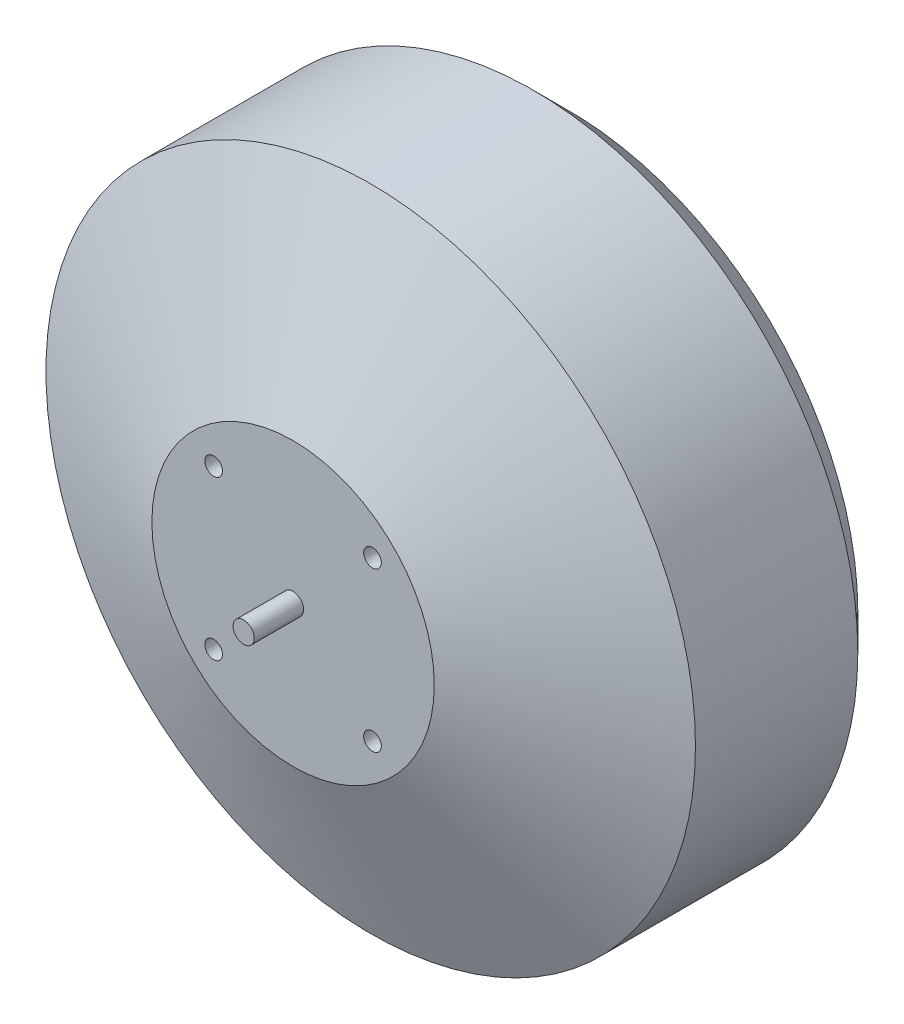
ISO-10303-21;
HEADER;
FILE_DESCRIPTION(('STEP AP214'),'2;1');
FILE_NAME('part.step','',(''),(''),'','','');
FILE_SCHEMA(('AUTOMOTIVE_DESIGN { 1 0 10303 214 1 1 1 1 }'));
ENDSEC;
DATA;
#1=APPLICATION_CONTEXT('core data for automotive mechanical design processes');
#2=APPLICATION_PROTOCOL_DEFINITION('international standard','automotive_design',2000,#1);
#3=PRODUCT_CONTEXT('',#1,'mechanical');
#4=PRODUCT('Part','Part','',(#3));
#5=PRODUCT_RELATED_PRODUCT_CATEGORY('part','',(#4));
#6=PRODUCT_DEFINITION_FORMATION('','',#4);
#7=PRODUCT_DEFINITION_CONTEXT('part definition',#1,'design');
#8=PRODUCT_DEFINITION('design','',#6,#7);
#9=PRODUCT_DEFINITION_SHAPE('','',#8);
#10=(LENGTH_UNIT() NAMED_UNIT(*) SI_UNIT(.MILLI.,.METRE.));
#11=(NAMED_UNIT(*) PLANE_ANGLE_UNIT() SI_UNIT($,.RADIAN.));
#12=(NAMED_UNIT(*) SI_UNIT($,.STERADIAN.) SOLID_ANGLE_UNIT());
#13=UNCERTAINTY_MEASURE_WITH_UNIT(LENGTH_MEASURE(1.E-05),#10,'distance_accuracy_value','');
#14=(GEOMETRIC_REPRESENTATION_CONTEXT(3) GLOBAL_UNCERTAINTY_ASSIGNED_CONTEXT((#13)) GLOBAL_UNIT_ASSIGNED_CONTEXT((#10,
#11,#12)) REPRESENTATION_CONTEXT('',''));
#15=CARTESIAN_POINT('',(0.,0.,0.));
#16=DIRECTION('',(0.,0.,1.));
#17=DIRECTION('',(1.,0.,0.));
#18=AXIS2_PLACEMENT_3D('',#15,#16,#17);
#19=CARTESIAN_POINT('',(0.,46.,0.));
#20=DIRECTION('',(0.,0.,1.));
#21=DIRECTION('',(1.,0.,0.));
#22=AXIS2_PLACEMENT_3D('',#19,#20,#21);
#23=PLANE('',#22);
#24=CARTESIAN_POINT('',(0.,0.,0.));
#25=DIRECTION('',(0.,0.,1.));
#26=DIRECTION('',(1.,0.,0.));
#27=AXIS2_PLACEMENT_3D('',#24,#25,#26);
#28=CIRCLE('',#27,40.9999999999999);
#29=CARTESIAN_POINT('',(40.9999999999999,0.,0.));
#30=VERTEX_POINT('',#29);
#31=EDGE_CURVE('E10',#30,#30,#28,.F.);
#32=ORIENTED_EDGE('',*,*,#31,.T.);
#33=EDGE_LOOP('',(#32));
#34=FACE_BOUND('',#33,.T.);
#35=CARTESIAN_POINT('',(0.,0.,0.));
#36=DIRECTION('',(0.,0.,1.));
#37=DIRECTION('',(1.,0.,0.));
#38=AXIS2_PLACEMENT_3D('',#35,#36,#37);
#39=CIRCLE('',#38,2.75);
#40=CARTESIAN_POINT('',(2.75,0.,0.));
#41=VERTEX_POINT('',#40);
#42=EDGE_CURVE('E46',#41,#41,#39,.T.);
#43=ORIENTED_EDGE('',*,*,#42,.T.);
#44=EDGE_LOOP('',(#43));
#45=FACE_BOUND('',#44,.T.);
#46=CARTESIAN_POINT('',(14.25,-14.25,0.));
#47=DIRECTION('',(0.,0.,-1.));
#48=DIRECTION('',(-1.,0.,0.));
#49=AXIS2_PLACEMENT_3D('',#46,#47,#48);
#50=CIRCLE('',#49,1.75);
#51=CARTESIAN_POINT('',(12.5,-14.25,0.));
#52=VERTEX_POINT('',#51);
#53=EDGE_CURVE('E91',#52,#52,#50,.T.);
#54=ORIENTED_EDGE('',*,*,#53,.F.);
#55=EDGE_LOOP('',(#54));
#56=FACE_BOUND('',#55,.T.);
#57=CARTESIAN_POINT('',(-14.25,-14.25,0.));
#58=DIRECTION('',(0.,0.,-1.));
#59=DIRECTION('',(-1.,0.,0.));
#60=AXIS2_PLACEMENT_3D('',#57,#58,#59);
#61=CIRCLE('',#60,1.75);
#62=CARTESIAN_POINT('',(-16.,-14.25,0.));
#63=VERTEX_POINT('',#62);
#64=EDGE_CURVE('E98',#63,#63,#61,.T.);
#65=ORIENTED_EDGE('',*,*,#64,.F.);
#66=EDGE_LOOP('',(#65));
#67=FACE_BOUND('',#66,.T.);
#68=CARTESIAN_POINT('',(-14.25,14.25,0.));
#69=DIRECTION('',(0.,0.,-1.));
#70=DIRECTION('',(-1.,0.,0.));
#71=AXIS2_PLACEMENT_3D('',#68,#69,#70);
#72=CIRCLE('',#71,1.75);
#73=CARTESIAN_POINT('',(-16.,14.25,0.));
#74=VERTEX_POINT('',#73);
#75=EDGE_CURVE('E104',#74,#74,#72,.T.);
#76=ORIENTED_EDGE('',*,*,#75,.F.);
#77=EDGE_LOOP('',(#76));
#78=FACE_BOUND('',#77,.T.);
#79=CARTESIAN_POINT('',(14.25,14.25,0.));
#80=DIRECTION('',(0.,0.,-1.));
#81=DIRECTION('',(-1.,0.,0.));
#82=AXIS2_PLACEMENT_3D('',#79,#80,#81);
#83=CIRCLE('',#82,1.75);
#84=CARTESIAN_POINT('',(12.5,14.25,0.));
#85=VERTEX_POINT('',#84);
#86=EDGE_CURVE('E85',#85,#85,#83,.T.);
#87=ORIENTED_EDGE('',*,*,#86,.F.);
#88=EDGE_LOOP('',(#87));
#89=FACE_BOUND('',#88,.T.);
#90=ADVANCED_FACE('F31',(#34,#45,#56,#67,#78,#89),#23,.F.);
#91=CARTESIAN_POINT('',(0.,0.,1764.48103895637));
#92=DIRECTION('',(0.,0.,1.));
#93=DIRECTION('',(1.,0.,0.));
#94=AXIS2_PLACEMENT_3D('',#91,#92,#93);
#95=CYLINDRICAL_SURFACE('',#94,46.);
#96=CARTESIAN_POINT('',(0.,0.,5.00000000000012));
#97=DIRECTION('',(0.,0.,1.));
#98=DIRECTION('',(1.,0.,0.));
#99=AXIS2_PLACEMENT_3D('',#96,#97,#98);
#100=CIRCLE('',#99,46.);
#101=CARTESIAN_POINT('',(46.,0.,5.00000000000012));
#102=VERTEX_POINT('',#101);
#103=EDGE_CURVE('E38',#102,#102,#100,.T.);
#104=ORIENTED_EDGE('',*,*,#103,.T.);
#105=EDGE_LOOP('',(#104));
#106=FACE_BOUND('',#105,.T.);
#107=CARTESIAN_POINT('',(0.,0.,28.));
#108=DIRECTION('',(0.,0.,1.));
#109=DIRECTION('',(1.,0.,0.));
#110=AXIS2_PLACEMENT_3D('',#107,#108,#109);
#111=CIRCLE('',#110,46.);
#112=CARTESIAN_POINT('',(46.,0.,28.));
#113=VERTEX_POINT('',#112);
#114=EDGE_CURVE('E54',#113,#113,#111,.T.);
#115=ORIENTED_EDGE('',*,*,#114,.F.);
#116=EDGE_LOOP('',(#115));
#117=FACE_BOUND('',#116,.T.);
#118=ADVANCED_FACE('F142',(#106,#117),#95,.T.);
#119=CARTESIAN_POINT('',(0.,0.,28.));
#120=DIRECTION('',(0.,0.,-1.));
#121=DIRECTION('',(-1.,0.,0.));
#122=AXIS2_PLACEMENT_3D('',#119,#120,#121);
#123=CONICAL_SURFACE('',#122,46.,1.17055566976093);
#124=CARTESIAN_POINT('',(0.,0.,38.9999999999999));
#125=DIRECTION('',(0.,0.,1.));
#126=DIRECTION('',(1.,0.,0.));
#127=AXIS2_PLACEMENT_3D('',#124,#125,#126);
#128=CIRCLE('',#127,20.);
#129=CARTESIAN_POINT('',(20.,0.,38.9999999999999));
#130=VERTEX_POINT('',#129);
#131=EDGE_CURVE('E57',#130,#130,#128,.T.);
#132=ORIENTED_EDGE('',*,*,#131,.F.);
#133=EDGE_LOOP('',(#132));
#134=FACE_BOUND('',#133,.T.);
#135=ORIENTED_EDGE('',*,*,#114,.T.);
#136=EDGE_LOOP('',(#135));
#137=FACE_BOUND('',#136,.T.);
#138=ADVANCED_FACE('F128',(#134,#137),#123,.T.);
#139=CARTESIAN_POINT('',(0.,20.,39.));
#140=DIRECTION('',(0.,0.,-1.));
#141=DIRECTION('',(-1.,0.,0.));
#142=AXIS2_PLACEMENT_3D('',#139,#140,#141);
#143=PLANE('',#142);
#144=CARTESIAN_POINT('',(0.,0.,39.));
#145=DIRECTION('',(0.,0.,-1.));
#146=DIRECTION('',(-1.,0.,0.));
#147=AXIS2_PLACEMENT_3D('',#144,#145,#146);
#148=CIRCLE('',#147,1.5);
#149=CARTESIAN_POINT('',(-1.5,0.,39.));
#150=VERTEX_POINT('',#149);
#151=EDGE_CURVE('E42',#150,#150,#148,.F.);
#152=ORIENTED_EDGE('',*,*,#151,.F.);
#153=EDGE_LOOP('',(#152));
#154=FACE_BOUND('',#153,.T.);
#155=CARTESIAN_POINT('',(-11.25,-11.25,39.));
#156=DIRECTION('',(0.,0.,1.));
#157=DIRECTION('',(1.,0.,0.));
#158=AXIS2_PLACEMENT_3D('',#155,#156,#157);
#159=CIRCLE('',#158,1.25);
#160=CARTESIAN_POINT('',(-10.,-11.25,39.));
#161=VERTEX_POINT('',#160);
#162=EDGE_CURVE('E67',#161,#161,#159,.T.);
#163=ORIENTED_EDGE('',*,*,#162,.F.);
#164=EDGE_LOOP('',(#163));
#165=FACE_BOUND('',#164,.T.);
#166=CARTESIAN_POINT('',(11.25,-11.25,39.));
#167=DIRECTION('',(0.,0.,1.));
#168=DIRECTION('',(1.,0.,0.));
#169=AXIS2_PLACEMENT_3D('',#166,#167,#168);
#170=CIRCLE('',#169,1.25);
#171=CARTESIAN_POINT('',(12.5,-11.25,39.));
#172=VERTEX_POINT('',#171);
#173=EDGE_CURVE('E74',#172,#172,#170,.T.);
#174=ORIENTED_EDGE('',*,*,#173,.F.);
#175=EDGE_LOOP('',(#174));
#176=FACE_BOUND('',#175,.T.);
#177=CARTESIAN_POINT('',(11.25,11.25,39.));
#178=DIRECTION('',(0.,0.,1.));
#179=DIRECTION('',(1.,0.,0.));
#180=AXIS2_PLACEMENT_3D('',#177,#178,#179);
#181=CIRCLE('',#180,1.25);
#182=CARTESIAN_POINT('',(12.5,11.25,39.));
#183=VERTEX_POINT('',#182);
#184=EDGE_CURVE('E80',#183,#183,#181,.T.);
#185=ORIENTED_EDGE('',*,*,#184,.F.);
#186=EDGE_LOOP('',(#185));
#187=FACE_BOUND('',#186,.T.);
#188=CARTESIAN_POINT('',(-11.25,11.25,39.));
#189=DIRECTION('',(0.,0.,1.));
#190=DIRECTION('',(1.,0.,0.));
#191=AXIS2_PLACEMENT_3D('',#188,#189,#190);
#192=CIRCLE('',#191,1.25);
#193=CARTESIAN_POINT('',(-10.,11.25,39.));
#194=VERTEX_POINT('',#193);
#195=EDGE_CURVE('E61',#194,#194,#192,.T.);
#196=ORIENTED_EDGE('',*,*,#195,.F.);
#197=EDGE_LOOP('',(#196));
#198=FACE_BOUND('',#197,.T.);
#199=ORIENTED_EDGE('',*,*,#131,.T.);
#200=EDGE_LOOP('',(#199));
#201=FACE_BOUND('',#200,.T.);
#202=ADVANCED_FACE('F124',(#154,#165,#176,#187,#198,#201),#143,.F.);
#203=CARTESIAN_POINT('',(-11.25,11.25,29.));
#204=DIRECTION('',(0.,0.,1.));
#205=DIRECTION('',(1.,0.,0.));
#206=AXIS2_PLACEMENT_3D('',#203,#204,#205);
#207=CYLINDRICAL_SURFACE('',#206,1.25);
#208=CARTESIAN_POINT('',(-11.25,11.25,29.));
#209=DIRECTION('',(0.,0.,1.));
#210=DIRECTION('',(1.,0.,0.));
#211=AXIS2_PLACEMENT_3D('',#208,#209,#210);
#212=CIRCLE('',#211,1.25);
#213=CARTESIAN_POINT('',(-10.,11.25,29.));
#214=VERTEX_POINT('',#213);
#215=EDGE_CURVE('E60',#214,#214,#212,.T.);
#216=ORIENTED_EDGE('',*,*,#215,.F.);
#217=EDGE_LOOP('',(#216));
#218=FACE_BOUND('',#217,.T.);
#219=ORIENTED_EDGE('',*,*,#195,.T.);
#220=EDGE_LOOP('',(#219));
#221=FACE_BOUND('',#220,.T.);
#222=ADVANCED_FACE('F127',(#218,#221),#207,.F.);
#223=CARTESIAN_POINT('',(-11.25,11.25,29.));
#224=DIRECTION('',(0.,0.,1.));
#225=DIRECTION('',(1.,0.,0.));
#226=AXIS2_PLACEMENT_3D('',#223,#224,#225);
#227=PLANE('',#226);
#228=ORIENTED_EDGE('',*,*,#215,.T.);
#229=EDGE_LOOP('',(#228));
#230=FACE_BOUND('',#229,.T.);
#231=ADVANCED_FACE('F214',(#230),#227,.T.);
#232=CARTESIAN_POINT('',(11.25,11.25,29.));
#233=DIRECTION('',(0.,0.,1.));
#234=DIRECTION('',(1.,0.,0.));
#235=AXIS2_PLACEMENT_3D('',#232,#233,#234);
#236=CYLINDRICAL_SURFACE('',#235,1.25);
#237=CARTESIAN_POINT('',(11.25,11.25,29.));
#238=DIRECTION('',(0.,0.,1.));
#239=DIRECTION('',(1.,0.,0.));
#240=AXIS2_PLACEMENT_3D('',#237,#238,#239);
#241=CIRCLE('',#240,1.25);
#242=CARTESIAN_POINT('',(12.5,11.25,29.));
#243=VERTEX_POINT('',#242);
#244=EDGE_CURVE('E64',#243,#243,#241,.T.);
#245=ORIENTED_EDGE('',*,*,#244,.F.);
#246=EDGE_LOOP('',(#245));
#247=FACE_BOUND('',#246,.T.);
#248=ORIENTED_EDGE('',*,*,#184,.T.);
#249=EDGE_LOOP('',(#248));
#250=FACE_BOUND('',#249,.T.);
#251=ADVANCED_FACE('F210',(#247,#250),#236,.F.);
#252=CARTESIAN_POINT('',(11.25,11.25,29.));
#253=DIRECTION('',(0.,0.,1.));
#254=DIRECTION('',(1.,0.,0.));
#255=AXIS2_PLACEMENT_3D('',#252,#253,#254);
#256=PLANE('',#255);
#257=ORIENTED_EDGE('',*,*,#244,.T.);
#258=EDGE_LOOP('',(#257));
#259=FACE_BOUND('',#258,.T.);
#260=ADVANCED_FACE('F206',(#259),#256,.T.);
#261=CARTESIAN_POINT('',(11.25,-11.25,29.));
#262=DIRECTION('',(0.,0.,1.));
#263=DIRECTION('',(1.,0.,0.));
#264=AXIS2_PLACEMENT_3D('',#261,#262,#263);
#265=CYLINDRICAL_SURFACE('',#264,1.25);
#266=CARTESIAN_POINT('',(11.25,-11.25,29.));
#267=DIRECTION('',(0.,0.,1.));
#268=DIRECTION('',(1.,0.,0.));
#269=AXIS2_PLACEMENT_3D('',#266,#267,#268);
#270=CIRCLE('',#269,1.25);
#271=CARTESIAN_POINT('',(12.5,-11.25,29.));
#272=VERTEX_POINT('',#271);
#273=EDGE_CURVE('E77',#272,#272,#270,.T.);
#274=ORIENTED_EDGE('',*,*,#273,.F.);
#275=EDGE_LOOP('',(#274));
#276=FACE_BOUND('',#275,.T.);
#277=ORIENTED_EDGE('',*,*,#173,.T.);
#278=EDGE_LOOP('',(#277));
#279=FACE_BOUND('',#278,.T.);
#280=ADVANCED_FACE('F209',(#276,#279),#265,.F.);
#281=CARTESIAN_POINT('',(11.25,-11.25,29.));
#282=DIRECTION('',(0.,0.,1.));
#283=DIRECTION('',(1.,0.,0.));
#284=AXIS2_PLACEMENT_3D('',#281,#282,#283);
#285=PLANE('',#284);
#286=ORIENTED_EDGE('',*,*,#273,.T.);
#287=EDGE_LOOP('',(#286));
#288=FACE_BOUND('',#287,.T.);
#289=ADVANCED_FACE('F216',(#288),#285,.T.);
#290=CARTESIAN_POINT('',(-11.25,-11.25,29.));
#291=DIRECTION('',(0.,0.,1.));
#292=DIRECTION('',(1.,0.,0.));
#293=AXIS2_PLACEMENT_3D('',#290,#291,#292);
#294=CYLINDRICAL_SURFACE('',#293,1.25);
#295=CARTESIAN_POINT('',(-11.25,-11.25,29.));
#296=DIRECTION('',(0.,0.,1.));
#297=DIRECTION('',(1.,0.,0.));
#298=AXIS2_PLACEMENT_3D('',#295,#296,#297);
#299=CIRCLE('',#298,1.25);
#300=CARTESIAN_POINT('',(-10.,-11.25,29.));
#301=VERTEX_POINT('',#300);
#302=EDGE_CURVE('E70',#301,#301,#299,.T.);
#303=ORIENTED_EDGE('',*,*,#302,.F.);
#304=EDGE_LOOP('',(#303));
#305=FACE_BOUND('',#304,.T.);
#306=ORIENTED_EDGE('',*,*,#162,.T.);
#307=EDGE_LOOP('',(#306));
#308=FACE_BOUND('',#307,.T.);
#309=ADVANCED_FACE('F219',(#305,#308),#294,.F.);
#310=CARTESIAN_POINT('',(-11.25,-11.25,29.));
#311=DIRECTION('',(0.,0.,1.));
#312=DIRECTION('',(1.,0.,0.));
#313=AXIS2_PLACEMENT_3D('',#310,#311,#312);
#314=PLANE('',#313);
#315=ORIENTED_EDGE('',*,*,#302,.T.);
#316=EDGE_LOOP('',(#315));
#317=FACE_BOUND('',#316,.T.);
#318=ADVANCED_FACE('F204',(#317),#314,.T.);
#319=CARTESIAN_POINT('',(14.25,14.25,10.));
#320=DIRECTION('',(0.,0.,-1.));
#321=DIRECTION('',(-1.,0.,0.));
#322=AXIS2_PLACEMENT_3D('',#319,#320,#321);
#323=CYLINDRICAL_SURFACE('',#322,1.75);
#324=CARTESIAN_POINT('',(14.25,14.25,10.));
#325=DIRECTION('',(0.,0.,-1.));
#326=DIRECTION('',(-1.,0.,0.));
#327=AXIS2_PLACEMENT_3D('',#324,#325,#326);
#328=CIRCLE('',#327,1.75);
#329=CARTESIAN_POINT('',(12.5,14.25,10.));
#330=VERTEX_POINT('',#329);
#331=EDGE_CURVE('E71',#330,#330,#328,.T.);
#332=ORIENTED_EDGE('',*,*,#331,.F.);
#333=EDGE_LOOP('',(#332));
#334=FACE_BOUND('',#333,.T.);
#335=ORIENTED_EDGE('',*,*,#86,.T.);
#336=EDGE_LOOP('',(#335));
#337=FACE_BOUND('',#336,.T.);
#338=ADVANCED_FACE('F200',(#334,#337),#323,.F.);
#339=CARTESIAN_POINT('',(14.25,14.25,10.));
#340=DIRECTION('',(0.,0.,-1.));
#341=DIRECTION('',(-1.,0.,0.));
#342=AXIS2_PLACEMENT_3D('',#339,#340,#341);
#343=PLANE('',#342);
#344=ORIENTED_EDGE('',*,*,#331,.T.);
#345=EDGE_LOOP('',(#344));
#346=FACE_BOUND('',#345,.T.);
#347=ADVANCED_FACE('F186',(#346),#343,.T.);
#348=CARTESIAN_POINT('',(-14.25,14.25,10.));
#349=DIRECTION('',(0.,0.,-1.));
#350=DIRECTION('',(-1.,0.,0.));
#351=AXIS2_PLACEMENT_3D('',#348,#349,#350);
#352=CYLINDRICAL_SURFACE('',#351,1.75);
#353=CARTESIAN_POINT('',(-14.25,14.25,10.));
#354=DIRECTION('',(0.,0.,-1.));
#355=DIRECTION('',(-1.,0.,0.));
#356=AXIS2_PLACEMENT_3D('',#353,#354,#355);
#357=CIRCLE('',#356,1.75);
#358=CARTESIAN_POINT('',(-16.,14.25,10.));
#359=VERTEX_POINT('',#358);
#360=EDGE_CURVE('E88',#359,#359,#357,.T.);
#361=ORIENTED_EDGE('',*,*,#360,.F.);
#362=EDGE_LOOP('',(#361));
#363=FACE_BOUND('',#362,.T.);
#364=ORIENTED_EDGE('',*,*,#75,.T.);
#365=EDGE_LOOP('',(#364));
#366=FACE_BOUND('',#365,.T.);
#367=ADVANCED_FACE('F182',(#363,#366),#352,.F.);
#368=CARTESIAN_POINT('',(-14.25,14.25,10.));
#369=DIRECTION('',(0.,0.,-1.));
#370=DIRECTION('',(-1.,0.,0.));
#371=AXIS2_PLACEMENT_3D('',#368,#369,#370);
#372=PLANE('',#371);
#373=ORIENTED_EDGE('',*,*,#360,.T.);
#374=EDGE_LOOP('',(#373));
#375=FACE_BOUND('',#374,.T.);
#376=ADVANCED_FACE('F178',(#375),#372,.T.);
#377=CARTESIAN_POINT('',(-14.25,-14.25,10.));
#378=DIRECTION('',(0.,0.,-1.));
#379=DIRECTION('',(-1.,0.,0.));
#380=AXIS2_PLACEMENT_3D('',#377,#378,#379);
#381=CYLINDRICAL_SURFACE('',#380,1.75);
#382=CARTESIAN_POINT('',(-14.25,-14.25,10.));
#383=DIRECTION('',(0.,0.,-1.));
#384=DIRECTION('',(-1.,0.,0.));
#385=AXIS2_PLACEMENT_3D('',#382,#383,#384);
#386=CIRCLE('',#385,1.75);
#387=CARTESIAN_POINT('',(-16.,-14.25,10.));
#388=VERTEX_POINT('',#387);
#389=EDGE_CURVE('E101',#388,#388,#386,.T.);
#390=ORIENTED_EDGE('',*,*,#389,.F.);
#391=EDGE_LOOP('',(#390));
#392=FACE_BOUND('',#391,.T.);
#393=ORIENTED_EDGE('',*,*,#64,.T.);
#394=EDGE_LOOP('',(#393));
#395=FACE_BOUND('',#394,.T.);
#396=ADVANCED_FACE('F181',(#392,#395),#381,.F.);
#397=CARTESIAN_POINT('',(-14.25,-14.25,10.));
#398=DIRECTION('',(0.,0.,-1.));
#399=DIRECTION('',(-1.,0.,0.));
#400=AXIS2_PLACEMENT_3D('',#397,#398,#399);
#401=PLANE('',#400);
#402=ORIENTED_EDGE('',*,*,#389,.T.);
#403=EDGE_LOOP('',(#402));
#404=FACE_BOUND('',#403,.T.);
#405=ADVANCED_FACE('F188',(#404),#401,.T.);
#406=CARTESIAN_POINT('',(14.25,-14.25,10.));
#407=DIRECTION('',(0.,0.,-1.));
#408=DIRECTION('',(-1.,0.,0.));
#409=AXIS2_PLACEMENT_3D('',#406,#407,#408);
#410=CYLINDRICAL_SURFACE('',#409,1.75);
#411=CARTESIAN_POINT('',(14.25,-14.25,10.));
#412=DIRECTION('',(0.,0.,-1.));
#413=DIRECTION('',(-1.,0.,0.));
#414=AXIS2_PLACEMENT_3D('',#411,#412,#413);
#415=CIRCLE('',#414,1.75);
#416=CARTESIAN_POINT('',(12.5,-14.25,10.));
#417=VERTEX_POINT('',#416);
#418=EDGE_CURVE('E94',#417,#417,#415,.T.);
#419=ORIENTED_EDGE('',*,*,#418,.F.);
#420=EDGE_LOOP('',(#419));
#421=FACE_BOUND('',#420,.T.);
#422=ORIENTED_EDGE('',*,*,#53,.T.);
#423=EDGE_LOOP('',(#422));
#424=FACE_BOUND('',#423,.T.);
#425=ADVANCED_FACE('F174',(#421,#424),#410,.F.);
#426=CARTESIAN_POINT('',(14.25,-14.25,10.));
#427=DIRECTION('',(0.,0.,-1.));
#428=DIRECTION('',(-1.,0.,0.));
#429=AXIS2_PLACEMENT_3D('',#426,#427,#428);
#430=PLANE('',#429);
#431=ORIENTED_EDGE('',*,*,#418,.T.);
#432=EDGE_LOOP('',(#431));
#433=FACE_BOUND('',#432,.T.);
#434=ADVANCED_FACE('F168',(#433),#430,.T.);
#435=CARTESIAN_POINT('',(0.,0.,5.));
#436=DIRECTION('',(0.,0.,-1.));
#437=DIRECTION('',(-1.,0.,0.));
#438=AXIS2_PLACEMENT_3D('',#435,#436,#437);
#439=CYLINDRICAL_SURFACE('',#438,1.75);
#440=CARTESIAN_POINT('',(0.,0.,1.));
#441=DIRECTION('',(0.,0.,1.));
#442=DIRECTION('',(1.,0.,0.));
#443=AXIS2_PLACEMENT_3D('',#440,#441,#442);
#444=CIRCLE('',#443,1.75);
#445=CARTESIAN_POINT('',(1.75,0.,1.));
#446=VERTEX_POINT('',#445);
#447=EDGE_CURVE('E51',#446,#446,#444,.F.);
#448=ORIENTED_EDGE('',*,*,#447,.T.);
#449=EDGE_LOOP('',(#448));
#450=FACE_BOUND('',#449,.T.);
#451=CARTESIAN_POINT('',(0.,0.,5.));
#452=DIRECTION('',(0.,0.,-1.));
#453=DIRECTION('',(-1.,0.,0.));
#454=AXIS2_PLACEMENT_3D('',#451,#452,#453);
#455=CIRCLE('',#454,1.75);
#456=CARTESIAN_POINT('',(-1.75,0.,5.));
#457=VERTEX_POINT('',#456);
#458=EDGE_CURVE('E95',#457,#457,#455,.T.);
#459=ORIENTED_EDGE('',*,*,#458,.F.);
#460=EDGE_LOOP('',(#459));
#461=FACE_BOUND('',#460,.T.);
#462=ADVANCED_FACE('F159',(#450,#461),#439,.F.);
#463=CARTESIAN_POINT('',(0.,0.,5.));
#464=DIRECTION('',(0.,0.,-1.));
#465=DIRECTION('',(-1.,0.,0.));
#466=AXIS2_PLACEMENT_3D('',#463,#464,#465);
#467=PLANE('',#466);
#468=ORIENTED_EDGE('',*,*,#458,.T.);
#469=EDGE_LOOP('',(#468));
#470=FACE_BOUND('',#469,.T.);
#471=ADVANCED_FACE('F154',(#470),#467,.T.);
#472=CARTESIAN_POINT('',(0.,0.,1.));
#473=DIRECTION('',(0.,0.,1.));
#474=DIRECTION('',(1.,0.,0.));
#475=AXIS2_PLACEMENT_3D('',#472,#473,#474);
#476=TOROIDAL_SURFACE('',#475,2.75,1.);
#477=ORIENTED_EDGE('',*,*,#42,.F.);
#478=EDGE_LOOP('',(#477));
#479=FACE_BOUND('',#478,.T.);
#480=ORIENTED_EDGE('',*,*,#447,.F.);
#481=EDGE_LOOP('',(#480));
#482=FACE_BOUND('',#481,.T.);
#483=ADVANCED_FACE('F120',(#479,#482),#476,.T.);
#484=CARTESIAN_POINT('',(0.,0.,46.));
#485=DIRECTION('',(0.,0.,-1.));
#486=DIRECTION('',(-1.,0.,0.));
#487=AXIS2_PLACEMENT_3D('',#484,#485,#486);
#488=CYLINDRICAL_SURFACE('',#487,1.5);
#489=CARTESIAN_POINT('',(0.,0.,46.));
#490=DIRECTION('',(0.,0.,1.));
#491=DIRECTION('',(1.,0.,0.));
#492=AXIS2_PLACEMENT_3D('',#489,#490,#491);
#493=CIRCLE('',#492,1.5);
#494=CARTESIAN_POINT('',(1.5,0.,46.));
#495=VERTEX_POINT('',#494);
#496=EDGE_CURVE('E111',#495,#495,#493,.T.);
#497=ORIENTED_EDGE('',*,*,#496,.F.);
#498=EDGE_LOOP('',(#497));
#499=FACE_BOUND('',#498,.T.);
#500=ORIENTED_EDGE('',*,*,#151,.T.);
#501=EDGE_LOOP('',(#500));
#502=FACE_BOUND('',#501,.T.);
#503=ADVANCED_FACE('F117',(#499,#502),#488,.T.);
#504=CARTESIAN_POINT('',(0.,0.,46.));
#505=DIRECTION('',(0.,0.,1.));
#506=DIRECTION('',(1.,0.,0.));
#507=AXIS2_PLACEMENT_3D('',#504,#505,#506);
#508=PLANE('',#507);
#509=ORIENTED_EDGE('',*,*,#496,.T.);
#510=EDGE_LOOP('',(#509));
#511=FACE_BOUND('',#510,.T.);
#512=ADVANCED_FACE('F115',(#511),#508,.T.);
#513=CARTESIAN_POINT('',(0.,0.,5.00000000000012));
#514=DIRECTION('',(0.,0.,1.));
#515=DIRECTION('',(1.,0.,0.));
#516=AXIS2_PLACEMENT_3D('',#513,#514,#515);
#517=CONICAL_SURFACE('',#516,46.,0.785398163397448);
#518=ORIENTED_EDGE('',*,*,#31,.F.);
#519=EDGE_LOOP('',(#518));
#520=FACE_BOUND('',#519,.T.);
#521=ORIENTED_EDGE('',*,*,#103,.F.);
#522=EDGE_LOOP('',(#521));
#523=FACE_BOUND('',#522,.T.);
#524=ADVANCED_FACE('F33',(#520,#523),#517,.T.);
#525=CLOSED_SHELL('',(#90,#118,#138,#202,#222,#231,#251,#260,#280,#289,#309,#318,#338,#347,#367,
#376,#396,#405,#425,#434,#462,#471,#483,#503,#512,#524));
#526=MANIFOLD_SOLID_BREP('B2',#525);
#527=ADVANCED_BREP_SHAPE_REPRESENTATION('',(#18,#526),#14);
#528=SHAPE_DEFINITION_REPRESENTATION(#9,#527);
ENDSEC;
END-ISO-10303-21;
